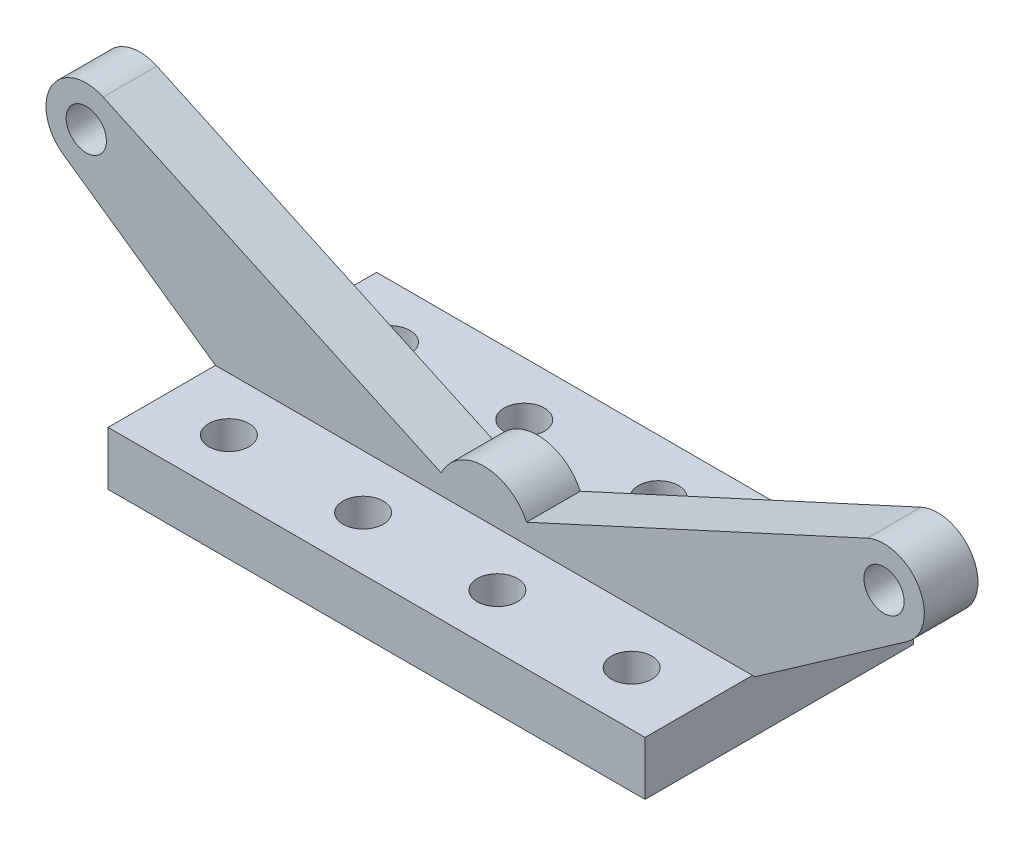
ISO-10303-21;
HEADER;
FILE_DESCRIPTION(('STEP AP214'),'2;1');
FILE_NAME('part.step','',(''),(''),'','','');
FILE_SCHEMA(('AUTOMOTIVE_DESIGN { 1 0 10303 214 1 1 1 1 }'));
ENDSEC;
DATA;
#1=APPLICATION_CONTEXT('core data for automotive mechanical design processes');
#2=APPLICATION_PROTOCOL_DEFINITION('international standard','automotive_design',2000,#1);
#3=PRODUCT_CONTEXT('',#1,'mechanical');
#4=PRODUCT('Part','Part','',(#3));
#5=PRODUCT_RELATED_PRODUCT_CATEGORY('part','',(#4));
#6=PRODUCT_DEFINITION_FORMATION('','',#4);
#7=PRODUCT_DEFINITION_CONTEXT('part definition',#1,'design');
#8=PRODUCT_DEFINITION('design','',#6,#7);
#9=PRODUCT_DEFINITION_SHAPE('','',#8);
#10=(LENGTH_UNIT() NAMED_UNIT(*) SI_UNIT(.MILLI.,.METRE.));
#11=(NAMED_UNIT(*) PLANE_ANGLE_UNIT() SI_UNIT($,.RADIAN.));
#12=(NAMED_UNIT(*) SI_UNIT($,.STERADIAN.) SOLID_ANGLE_UNIT());
#13=UNCERTAINTY_MEASURE_WITH_UNIT(LENGTH_MEASURE(1.E-05),#10,'distance_accuracy_value','');
#14=(GEOMETRIC_REPRESENTATION_CONTEXT(3) GLOBAL_UNCERTAINTY_ASSIGNED_CONTEXT((#13)) GLOBAL_UNIT_ASSIGNED_CONTEXT((#10,
#11,#12)) REPRESENTATION_CONTEXT('',''));
#15=CARTESIAN_POINT('',(0.,0.,0.));
#16=DIRECTION('',(0.,0.,1.));
#17=DIRECTION('',(1.,0.,0.));
#18=AXIS2_PLACEMENT_3D('',#15,#16,#17);
#19=CARTESIAN_POINT('',(-75.,20.,30.));
#20=DIRECTION('',(0.,1.,0.));
#21=DIRECTION('',(0.,0.,1.));
#22=AXIS2_PLACEMENT_3D('',#19,#20,#21);
#23=CYLINDRICAL_SURFACE('',#22,7.50000000000001);
#24=CARTESIAN_POINT('',(-75.,20.,30.));
#25=DIRECTION('',(0.,1.,0.));
#26=DIRECTION('',(0.,0.,1.));
#27=AXIS2_PLACEMENT_3D('',#24,#25,#26);
#28=CIRCLE('',#27,7.50000000000001);
#29=CARTESIAN_POINT('',(-75.,20.,37.5));
#30=VERTEX_POINT('',#29);
#31=EDGE_CURVE('E53',#30,#30,#28,.T.);
#32=ORIENTED_EDGE('',*,*,#31,.T.);
#33=EDGE_LOOP('',(#32));
#34=FACE_BOUND('',#33,.T.);
#35=CARTESIAN_POINT('',(-75.,0.,30.));
#36=DIRECTION('',(0.,-1.,0.));
#37=DIRECTION('',(0.,0.,-1.));
#38=AXIS2_PLACEMENT_3D('',#35,#36,#37);
#39=CIRCLE('',#38,7.50000000000001);
#40=CARTESIAN_POINT('',(-75.,0.,22.5));
#41=VERTEX_POINT('',#40);
#42=EDGE_CURVE('E11',#41,#41,#39,.T.);
#43=ORIENTED_EDGE('',*,*,#42,.T.);
#44=EDGE_LOOP('',(#43));
#45=FACE_BOUND('',#44,.T.);
#46=ADVANCED_FACE('F45',(#34,#45),#23,.F.);
#47=CARTESIAN_POINT('',(-25.,20.,30.));
#48=DIRECTION('',(0.,1.,0.));
#49=DIRECTION('',(0.,0.,1.));
#50=AXIS2_PLACEMENT_3D('',#47,#48,#49);
#51=CYLINDRICAL_SURFACE('',#50,7.50000000000001);
#52=CARTESIAN_POINT('',(-25.,20.,30.));
#53=DIRECTION('',(0.,1.,0.));
#54=DIRECTION('',(0.,0.,1.));
#55=AXIS2_PLACEMENT_3D('',#52,#53,#54);
#56=CIRCLE('',#55,7.50000000000001);
#57=CARTESIAN_POINT('',(-25.,20.,37.5));
#58=VERTEX_POINT('',#57);
#59=EDGE_CURVE('E280',#58,#58,#56,.T.);
#60=ORIENTED_EDGE('',*,*,#59,.T.);
#61=EDGE_LOOP('',(#60));
#62=FACE_BOUND('',#61,.T.);
#63=CARTESIAN_POINT('',(-25.,0.,30.));
#64=DIRECTION('',(0.,-1.,0.));
#65=DIRECTION('',(0.,0.,-1.));
#66=AXIS2_PLACEMENT_3D('',#63,#64,#65);
#67=CIRCLE('',#66,7.50000000000001);
#68=CARTESIAN_POINT('',(-25.,0.,22.5));
#69=VERTEX_POINT('',#68);
#70=EDGE_CURVE('E296',#69,#69,#67,.T.);
#71=ORIENTED_EDGE('',*,*,#70,.T.);
#72=EDGE_LOOP('',(#71));
#73=FACE_BOUND('',#72,.T.);
#74=ADVANCED_FACE('F326',(#62,#73),#51,.F.);
#75=CARTESIAN_POINT('',(-100.,20.,-50.));
#76=DIRECTION('',(0.,1.,0.));
#77=DIRECTION('',(0.,0.,1.));
#78=AXIS2_PLACEMENT_3D('',#75,#76,#77);
#79=PLANE('',#78);
#80=CARTESIAN_POINT('',(-75.,20.,-30.));
#81=DIRECTION('',(0.,1.,0.));
#82=DIRECTION('',(0.,0.,1.));
#83=AXIS2_PLACEMENT_3D('',#80,#81,#82);
#84=CIRCLE('',#83,7.50000000000001);
#85=CARTESIAN_POINT('',(-75.,20.,-22.5));
#86=VERTEX_POINT('',#85);
#87=EDGE_CURVE('E603',#86,#86,#84,.T.);
#88=ORIENTED_EDGE('',*,*,#87,.F.);
#89=EDGE_LOOP('',(#88));
#90=FACE_BOUND('',#89,.T.);
#91=CARTESIAN_POINT('',(-25.,20.,-30.));
#92=DIRECTION('',(0.,1.,0.));
#93=DIRECTION('',(0.,0.,1.));
#94=AXIS2_PLACEMENT_3D('',#91,#92,#93);
#95=CIRCLE('',#94,7.50000000000001);
#96=CARTESIAN_POINT('',(-25.,20.,-22.5));
#97=VERTEX_POINT('',#96);
#98=EDGE_CURVE('E605',#97,#97,#95,.T.);
#99=ORIENTED_EDGE('',*,*,#98,.F.);
#100=EDGE_LOOP('',(#99));
#101=FACE_BOUND('',#100,.T.);
#102=CARTESIAN_POINT('',(25.,20.,-30.));
#103=DIRECTION('',(0.,1.,0.));
#104=DIRECTION('',(0.,0.,1.));
#105=AXIS2_PLACEMENT_3D('',#102,#103,#104);
#106=CIRCLE('',#105,7.50000000000001);
#107=CARTESIAN_POINT('',(25.,20.,-22.5));
#108=VERTEX_POINT('',#107);
#109=EDGE_CURVE('E615',#108,#108,#106,.T.);
#110=ORIENTED_EDGE('',*,*,#109,.F.);
#111=EDGE_LOOP('',(#110));
#112=FACE_BOUND('',#111,.T.);
#113=CARTESIAN_POINT('',(75.,20.,-30.));
#114=DIRECTION('',(0.,1.,0.));
#115=DIRECTION('',(0.,0.,1.));
#116=AXIS2_PLACEMENT_3D('',#113,#114,#115);
#117=CIRCLE('',#116,7.50000000000001);
#118=CARTESIAN_POINT('',(75.,20.,-22.5));
#119=VERTEX_POINT('',#118);
#120=EDGE_CURVE('E621',#119,#119,#117,.T.);
#121=ORIENTED_EDGE('',*,*,#120,.F.);
#122=EDGE_LOOP('',(#121));
#123=FACE_BOUND('',#122,.T.);
#124=DIRECTION('',(0.,0.,1.));
#125=VECTOR('',#124,1.);
#126=CARTESIAN_POINT('',(-100.,20.,-50.));
#127=LINE('',#126,#125);
#128=CARTESIAN_POINT('',(-100.,20.,-50.));
#129=VERTEX_POINT('',#128);
#130=CARTESIAN_POINT('',(-100.,20.,-10.));
#131=VERTEX_POINT('',#130);
#132=EDGE_CURVE('E68',#129,#131,#127,.T.);
#133=ORIENTED_EDGE('',*,*,#132,.T.);
#134=DIRECTION('',(1.,0.,0.));
#135=VECTOR('',#134,1.);
#136=CARTESIAN_POINT('',(-100.,20.,-10.));
#137=LINE('',#136,#135);
#138=CARTESIAN_POINT('',(100.,20.,-10.));
#139=VERTEX_POINT('',#138);
#140=EDGE_CURVE('E205',#131,#139,#137,.T.);
#141=ORIENTED_EDGE('',*,*,#140,.T.);
#142=DIRECTION('',(0.,0.,1.));
#143=VECTOR('',#142,1.);
#144=CARTESIAN_POINT('',(100.,20.,-50.));
#145=LINE('',#144,#143);
#146=CARTESIAN_POINT('',(100.,20.,-50.));
#147=VERTEX_POINT('',#146);
#148=EDGE_CURVE('E282',#147,#139,#145,.T.);
#149=ORIENTED_EDGE('',*,*,#148,.F.);
#150=DIRECTION('',(-1.,0.,0.));
#151=VECTOR('',#150,1.);
#152=CARTESIAN_POINT('',(-100.,20.,-50.));
#153=LINE('',#152,#151);
#154=EDGE_CURVE('E273',#147,#129,#153,.T.);
#155=ORIENTED_EDGE('',*,*,#154,.T.);
#156=EDGE_LOOP('',(#133,#141,#149,#155));
#157=FACE_BOUND('',#156,.T.);
#158=ADVANCED_FACE('F311',(#90,#101,#112,#123,#157),#79,.T.);
#159=CARTESIAN_POINT('',(-100.,20.,-50.));
#160=DIRECTION('',(-1.,0.,0.));
#161=DIRECTION('',(0.,0.,1.));
#162=AXIS2_PLACEMENT_3D('',#159,#160,#161);
#163=PLANE('',#162);
#164=DIRECTION('',(0.,0.,1.));
#165=VECTOR('',#164,1.);
#166=CARTESIAN_POINT('',(-100.,0.,-50.));
#167=LINE('',#166,#165);
#168=CARTESIAN_POINT('',(-100.,0.,-50.));
#169=VERTEX_POINT('',#168);
#170=CARTESIAN_POINT('',(-100.,0.,50.));
#171=VERTEX_POINT('',#170);
#172=EDGE_CURVE('E277',#169,#171,#167,.T.);
#173=ORIENTED_EDGE('',*,*,#172,.T.);
#174=DIRECTION('',(0.,-1.,0.));
#175=VECTOR('',#174,1.);
#176=CARTESIAN_POINT('',(-100.,20.,50.));
#177=LINE('',#176,#175);
#178=CARTESIAN_POINT('',(-100.,20.,50.));
#179=VERTEX_POINT('',#178);
#180=EDGE_CURVE('E228',#179,#171,#177,.T.);
#181=ORIENTED_EDGE('',*,*,#180,.F.);
#182=CARTESIAN_POINT('',(-100.,20.,10.));
#183=VERTEX_POINT('',#182);
#184=EDGE_CURVE('E281',#183,#179,#127,.T.);
#185=ORIENTED_EDGE('',*,*,#184,.F.);
#186=DIRECTION('',(0.,0.,1.));
#187=VECTOR('',#186,1.);
#188=CARTESIAN_POINT('',(-100.,20.,-10.));
#189=LINE('',#188,#187);
#190=EDGE_CURVE('E154',#131,#183,#189,.T.);
#191=ORIENTED_EDGE('',*,*,#190,.F.);
#192=ORIENTED_EDGE('',*,*,#132,.F.);
#193=DIRECTION('',(0.,-1.,0.));
#194=VECTOR('',#193,1.);
#195=CARTESIAN_POINT('',(-100.,20.,-50.));
#196=LINE('',#195,#194);
#197=EDGE_CURVE('E262',#129,#169,#196,.T.);
#198=ORIENTED_EDGE('',*,*,#197,.T.);
#199=EDGE_LOOP('',(#173,#181,#185,#191,#192,#198));
#200=FACE_BOUND('',#199,.T.);
#201=ADVANCED_FACE('F308',(#200),#163,.T.);
#202=CARTESIAN_POINT('',(25.,20.,30.));
#203=DIRECTION('',(0.,1.,0.));
#204=DIRECTION('',(0.,0.,1.));
#205=AXIS2_PLACEMENT_3D('',#202,#203,#204);
#206=CIRCLE('',#205,7.50000000000001);
#207=CARTESIAN_POINT('',(25.,20.,37.5));
#208=VERTEX_POINT('',#207);
#209=EDGE_CURVE('E627',#208,#208,#206,.T.);
#210=ORIENTED_EDGE('',*,*,#209,.F.);
#211=EDGE_LOOP('',(#210));
#212=FACE_BOUND('',#211,.T.);
#213=CARTESIAN_POINT('',(75.,20.,30.));
#214=DIRECTION('',(0.,1.,0.));
#215=DIRECTION('',(0.,0.,1.));
#216=AXIS2_PLACEMENT_3D('',#213,#214,#215);
#217=CIRCLE('',#216,7.50000000000001);
#218=CARTESIAN_POINT('',(75.,20.,37.5));
#219=VERTEX_POINT('',#218);
#220=EDGE_CURVE('E633',#219,#219,#217,.T.);
#221=ORIENTED_EDGE('',*,*,#220,.F.);
#222=EDGE_LOOP('',(#221));
#223=FACE_BOUND('',#222,.T.);
#224=DIRECTION('',(1.,0.,0.));
#225=VECTOR('',#224,1.);
#226=CARTESIAN_POINT('',(-100.,20.,10.));
#227=LINE('',#226,#225);
#228=CARTESIAN_POINT('',(100.,20.,10.));
#229=VERTEX_POINT('',#228);
#230=EDGE_CURVE('E179',#183,#229,#227,.T.);
#231=ORIENTED_EDGE('',*,*,#230,.F.);
#232=ORIENTED_EDGE('',*,*,#184,.T.);
#233=DIRECTION('',(-1.,0.,0.));
#234=VECTOR('',#233,1.);
#235=CARTESIAN_POINT('',(-100.,20.,50.));
#236=LINE('',#235,#234);
#237=CARTESIAN_POINT('',(100.,20.,50.));
#238=VERTEX_POINT('',#237);
#239=EDGE_CURVE('E258',#238,#179,#236,.T.);
#240=ORIENTED_EDGE('',*,*,#239,.F.);
#241=EDGE_CURVE('E287',#229,#238,#145,.T.);
#242=ORIENTED_EDGE('',*,*,#241,.F.);
#243=EDGE_LOOP('',(#231,#232,#240,#242));
#244=FACE_BOUND('',#243,.T.);
#245=ORIENTED_EDGE('',*,*,#59,.F.);
#246=EDGE_LOOP('',(#245));
#247=FACE_BOUND('',#246,.T.);
#248=ORIENTED_EDGE('',*,*,#31,.F.);
#249=EDGE_LOOP('',(#248));
#250=FACE_BOUND('',#249,.T.);
#251=ADVANCED_FACE('F305',(#212,#223,#244,#247,#250),#79,.T.);
#252=CARTESIAN_POINT('',(100.,20.,-50.));
#253=DIRECTION('',(1.,0.,0.));
#254=DIRECTION('',(0.,0.,-1.));
#255=AXIS2_PLACEMENT_3D('',#252,#253,#254);
#256=PLANE('',#255);
#257=ORIENTED_EDGE('',*,*,#148,.T.);
#258=EDGE_CURVE('E286',#139,#229,#145,.T.);
#259=ORIENTED_EDGE('',*,*,#258,.T.);
#260=ORIENTED_EDGE('',*,*,#241,.T.);
#261=DIRECTION('',(0.,1.,0.));
#262=VECTOR('',#261,1.);
#263=CARTESIAN_POINT('',(100.,20.,50.));
#264=LINE('',#263,#262);
#265=CARTESIAN_POINT('',(100.,0.,50.));
#266=VERTEX_POINT('',#265);
#267=EDGE_CURVE('E254',#266,#238,#264,.T.);
#268=ORIENTED_EDGE('',*,*,#267,.F.);
#269=DIRECTION('',(0.,0.,1.));
#270=VECTOR('',#269,1.);
#271=CARTESIAN_POINT('',(100.,0.,-50.));
#272=LINE('',#271,#270);
#273=CARTESIAN_POINT('',(100.,0.,-50.));
#274=VERTEX_POINT('',#273);
#275=EDGE_CURVE('E288',#274,#266,#272,.T.);
#276=ORIENTED_EDGE('',*,*,#275,.F.);
#277=DIRECTION('',(0.,1.,0.));
#278=VECTOR('',#277,1.);
#279=CARTESIAN_POINT('',(100.,20.,-50.));
#280=LINE('',#279,#278);
#281=EDGE_CURVE('E269',#274,#147,#280,.T.);
#282=ORIENTED_EDGE('',*,*,#281,.T.);
#283=EDGE_LOOP('',(#257,#259,#260,#268,#276,#282));
#284=FACE_BOUND('',#283,.T.);
#285=ADVANCED_FACE('F307',(#284),#256,.T.);
#286=CARTESIAN_POINT('',(-100.,0.,-50.));
#287=DIRECTION('',(0.,-1.,0.));
#288=DIRECTION('',(0.,0.,-1.));
#289=AXIS2_PLACEMENT_3D('',#286,#287,#288);
#290=PLANE('',#289);
#291=CARTESIAN_POINT('',(-75.,0.,-30.));
#292=DIRECTION('',(0.,-1.,0.));
#293=DIRECTION('',(0.,0.,-1.));
#294=AXIS2_PLACEMENT_3D('',#291,#292,#293);
#295=CIRCLE('',#294,7.50000000000001);
#296=CARTESIAN_POINT('',(-75.,0.,-37.5));
#297=VERTEX_POINT('',#296);
#298=EDGE_CURVE('E349',#297,#297,#295,.T.);
#299=ORIENTED_EDGE('',*,*,#298,.F.);
#300=EDGE_LOOP('',(#299));
#301=FACE_BOUND('',#300,.T.);
#302=CARTESIAN_POINT('',(-25.,0.,-30.));
#303=DIRECTION('',(0.,-1.,0.));
#304=DIRECTION('',(0.,0.,-1.));
#305=AXIS2_PLACEMENT_3D('',#302,#303,#304);
#306=CIRCLE('',#305,7.50000000000001);
#307=CARTESIAN_POINT('',(-25.,0.,-37.5));
#308=VERTEX_POINT('',#307);
#309=EDGE_CURVE('E353',#308,#308,#306,.T.);
#310=ORIENTED_EDGE('',*,*,#309,.F.);
#311=EDGE_LOOP('',(#310));
#312=FACE_BOUND('',#311,.T.);
#313=CARTESIAN_POINT('',(25.,0.,-30.));
#314=DIRECTION('',(0.,-1.,0.));
#315=DIRECTION('',(0.,0.,-1.));
#316=AXIS2_PLACEMENT_3D('',#313,#314,#315);
#317=CIRCLE('',#316,7.50000000000001);
#318=CARTESIAN_POINT('',(25.,0.,-37.5));
#319=VERTEX_POINT('',#318);
#320=EDGE_CURVE('E357',#319,#319,#317,.T.);
#321=ORIENTED_EDGE('',*,*,#320,.F.);
#322=EDGE_LOOP('',(#321));
#323=FACE_BOUND('',#322,.T.);
#324=CARTESIAN_POINT('',(75.,0.,-30.));
#325=DIRECTION('',(0.,-1.,0.));
#326=DIRECTION('',(0.,0.,-1.));
#327=AXIS2_PLACEMENT_3D('',#324,#325,#326);
#328=CIRCLE('',#327,7.50000000000001);
#329=CARTESIAN_POINT('',(75.,0.,-37.5));
#330=VERTEX_POINT('',#329);
#331=EDGE_CURVE('E361',#330,#330,#328,.T.);
#332=ORIENTED_EDGE('',*,*,#331,.F.);
#333=EDGE_LOOP('',(#332));
#334=FACE_BOUND('',#333,.T.);
#335=CARTESIAN_POINT('',(25.,0.,30.));
#336=DIRECTION('',(0.,-1.,0.));
#337=DIRECTION('',(0.,0.,-1.));
#338=AXIS2_PLACEMENT_3D('',#335,#336,#337);
#339=CIRCLE('',#338,7.50000000000001);
#340=CARTESIAN_POINT('',(25.,0.,22.5));
#341=VERTEX_POINT('',#340);
#342=EDGE_CURVE('E365',#341,#341,#339,.T.);
#343=ORIENTED_EDGE('',*,*,#342,.F.);
#344=EDGE_LOOP('',(#343));
#345=FACE_BOUND('',#344,.T.);
#346=CARTESIAN_POINT('',(75.,0.,30.));
#347=DIRECTION('',(0.,-1.,0.));
#348=DIRECTION('',(0.,0.,-1.));
#349=AXIS2_PLACEMENT_3D('',#346,#347,#348);
#350=CIRCLE('',#349,7.50000000000001);
#351=CARTESIAN_POINT('',(75.,0.,22.5));
#352=VERTEX_POINT('',#351);
#353=EDGE_CURVE('E369',#352,#352,#350,.T.);
#354=ORIENTED_EDGE('',*,*,#353,.F.);
#355=EDGE_LOOP('',(#354));
#356=FACE_BOUND('',#355,.T.);
#357=ORIENTED_EDGE('',*,*,#275,.T.);
#358=DIRECTION('',(1.,0.,0.));
#359=VECTOR('',#358,1.);
#360=CARTESIAN_POINT('',(-100.,0.,50.));
#361=LINE('',#360,#359);
#362=EDGE_CURVE('E250',#171,#266,#361,.T.);
#363=ORIENTED_EDGE('',*,*,#362,.F.);
#364=ORIENTED_EDGE('',*,*,#172,.F.);
#365=DIRECTION('',(1.,0.,0.));
#366=VECTOR('',#365,1.);
#367=CARTESIAN_POINT('',(-100.,0.,-50.));
#368=LINE('',#367,#366);
#369=EDGE_CURVE('E265',#169,#274,#368,.T.);
#370=ORIENTED_EDGE('',*,*,#369,.T.);
#371=EDGE_LOOP('',(#357,#363,#364,#370));
#372=FACE_BOUND('',#371,.T.);
#373=ORIENTED_EDGE('',*,*,#70,.F.);
#374=EDGE_LOOP('',(#373));
#375=FACE_BOUND('',#374,.T.);
#376=ORIENTED_EDGE('',*,*,#42,.F.);
#377=EDGE_LOOP('',(#376));
#378=FACE_BOUND('',#377,.T.);
#379=ADVANCED_FACE('F317',(#301,#312,#323,#334,#345,#356,#372,#375,#378),#290,.T.);
#380=CARTESIAN_POINT('',(0.,0.,-50.));
#381=DIRECTION('',(0.,0.,1.));
#382=DIRECTION('',(1.,0.,0.));
#383=AXIS2_PLACEMENT_3D('',#380,#381,#382);
#384=PLANE('',#383);
#385=ORIENTED_EDGE('',*,*,#197,.F.);
#386=ORIENTED_EDGE('',*,*,#154,.F.);
#387=ORIENTED_EDGE('',*,*,#281,.F.);
#388=ORIENTED_EDGE('',*,*,#369,.F.);
#389=EDGE_LOOP('',(#385,#386,#387,#388));
#390=FACE_BOUND('',#389,.T.);
#391=ADVANCED_FACE('F338',(#390),#384,.F.);
#392=CARTESIAN_POINT('',(0.,0.,50.));
#393=DIRECTION('',(0.,0.,1.));
#394=DIRECTION('',(1.,0.,0.));
#395=AXIS2_PLACEMENT_3D('',#392,#393,#394);
#396=PLANE('',#395);
#397=ORIENTED_EDGE('',*,*,#180,.T.);
#398=ORIENTED_EDGE('',*,*,#362,.T.);
#399=ORIENTED_EDGE('',*,*,#267,.T.);
#400=ORIENTED_EDGE('',*,*,#239,.T.);
#401=EDGE_LOOP('',(#397,#398,#399,#400));
#402=FACE_BOUND('',#401,.T.);
#403=ADVANCED_FACE('F344',(#402),#396,.T.);
#404=CARTESIAN_POINT('',(-100.,20.,-10.));
#405=DIRECTION('',(0.,-1.,0.));
#406=DIRECTION('',(0.,0.,-1.));
#407=AXIS2_PLACEMENT_3D('',#404,#405,#406);
#408=PLANE('',#407);
#409=ORIENTED_EDGE('',*,*,#258,.F.);
#410=CARTESIAN_POINT('',(100.888005583727,20.,-10.));
#411=VERTEX_POINT('',#410);
#412=EDGE_CURVE('E60',#139,#411,#137,.T.);
#413=ORIENTED_EDGE('',*,*,#412,.T.);
#414=DIRECTION('',(0.,0.,1.));
#415=VECTOR('',#414,1.);
#416=CARTESIAN_POINT('',(100.888005583727,20.,-10.));
#417=LINE('',#416,#415);
#418=CARTESIAN_POINT('',(100.888005583727,20.,10.));
#419=VERTEX_POINT('',#418);
#420=EDGE_CURVE('E241',#411,#419,#417,.T.);
#421=ORIENTED_EDGE('',*,*,#420,.T.);
#422=EDGE_CURVE('E164',#229,#419,#227,.T.);
#423=ORIENTED_EDGE('',*,*,#422,.F.);
#424=EDGE_LOOP('',(#409,#413,#421,#423));
#425=FACE_BOUND('',#424,.T.);
#426=ADVANCED_FACE('F412',(#425),#408,.T.);
#427=CARTESIAN_POINT('',(-148.111994416273,72.,-10.));
#428=DIRECTION('',(0.,0.,1.));
#429=DIRECTION('',(1.,0.,0.));
#430=AXIS2_PLACEMENT_3D('',#427,#428,#429);
#431=CYLINDRICAL_SURFACE('',#430,15.);
#432=DIRECTION('',(0.,0.,1.));
#433=VECTOR('',#432,1.);
#434=CARTESIAN_POINT('',(-156.715640961539,59.7127193356651,-10.));
#435=LINE('',#434,#433);
#436=CARTESIAN_POINT('',(-156.715640961539,59.7127193356651,-10.));
#437=VERTEX_POINT('',#436);
#438=CARTESIAN_POINT('',(-156.715640961539,59.7127193356651,10.));
#439=VERTEX_POINT('',#438);
#440=EDGE_CURVE('E142',#437,#439,#435,.T.);
#441=ORIENTED_EDGE('',*,*,#440,.T.);
#442=CARTESIAN_POINT('',(-148.111994416273,72.,10.));
#443=DIRECTION('',(0.,0.,1.));
#444=DIRECTION('',(1.,0.,0.));
#445=AXIS2_PLACEMENT_3D('',#442,#443,#444);
#446=CIRCLE('',#445,15.);
#447=CARTESIAN_POINT('',(-141.813369554398,85.613497891775,10.));
#448=VERTEX_POINT('',#447);
#449=EDGE_CURVE('E146',#448,#439,#446,.T.);
#450=ORIENTED_EDGE('',*,*,#449,.F.);
#451=DIRECTION('',(0.,0.,1.));
#452=VECTOR('',#451,1.);
#453=CARTESIAN_POINT('',(-141.813369554398,85.613497891775,-10.));
#454=LINE('',#453,#452);
#455=CARTESIAN_POINT('',(-141.813369554398,85.613497891775,-10.));
#456=VERTEX_POINT('',#455);
#457=EDGE_CURVE('E225',#456,#448,#454,.T.);
#458=ORIENTED_EDGE('',*,*,#457,.F.);
#459=CARTESIAN_POINT('',(-148.111994416273,72.,-10.));
#460=DIRECTION('',(0.,0.,1.));
#461=DIRECTION('',(1.,0.,0.));
#462=AXIS2_PLACEMENT_3D('',#459,#460,#461);
#463=CIRCLE('',#462,15.);
#464=EDGE_CURVE('E149',#456,#437,#463,.T.);
#465=ORIENTED_EDGE('',*,*,#464,.T.);
#466=EDGE_LOOP('',(#441,#450,#458,#465));
#467=FACE_BOUND('',#466,.T.);
#468=ADVANCED_FACE('F144',(#467),#431,.T.);
#469=CARTESIAN_POINT('',(-141.813369554398,85.613497891775,-10.));
#470=DIRECTION('',(-0.419908324125033,-0.907566526118337,0.));
#471=DIRECTION('',(0.907566526118337,-0.419908324125033,0.));
#472=AXIS2_PLACEMENT_3D('',#469,#470,#471);
#473=PLANE('',#472);
#474=ORIENTED_EDGE('',*,*,#457,.T.);
#475=DIRECTION('',(0.907566526118337,-0.419908324125033,0.));
#476=VECTOR('',#475,1.);
#477=CARTESIAN_POINT('',(-141.813369554398,85.613497891775,10.));
#478=LINE('',#477,#476);
#479=CARTESIAN_POINT('',(-15.8824142070709,27.348395672188,10.));
#480=VERTEX_POINT('',#479);
#481=EDGE_CURVE('E169',#448,#480,#478,.T.);
#482=ORIENTED_EDGE('',*,*,#481,.T.);
#483=DIRECTION('',(0.,0.,1.));
#484=VECTOR('',#483,1.);
#485=CARTESIAN_POINT('',(-15.8824142070709,27.348395672188,-10.));
#486=LINE('',#485,#484);
#487=CARTESIAN_POINT('',(-15.8824142070709,27.348395672188,-10.));
#488=VERTEX_POINT('',#487);
#489=EDGE_CURVE('E229',#488,#480,#486,.T.);
#490=ORIENTED_EDGE('',*,*,#489,.F.);
#491=DIRECTION('',(0.907566526118337,-0.419908324125033,0.));
#492=VECTOR('',#491,1.);
#493=CARTESIAN_POINT('',(-141.813369554398,85.613497891775,-10.));
#494=LINE('',#493,#492);
#495=EDGE_CURVE('E155',#456,#488,#494,.T.);
#496=ORIENTED_EDGE('',*,*,#495,.F.);
#497=EDGE_LOOP('',(#474,#482,#490,#496));
#498=FACE_BOUND('',#497,.T.);
#499=ADVANCED_FACE('F397',(#498),#473,.F.);
#500=CARTESIAN_POINT('',(0.,20.,-10.));
#501=DIRECTION('',(0.,0.,1.));
#502=DIRECTION('',(1.,0.,0.));
#503=AXIS2_PLACEMENT_3D('',#500,#501,#502);
#504=CYLINDRICAL_SURFACE('',#503,17.5);
#505=ORIENTED_EDGE('',*,*,#489,.T.);
#506=CARTESIAN_POINT('',(0.,20.,10.));
#507=DIRECTION('',(0.,0.,-1.));
#508=DIRECTION('',(-1.,0.,0.));
#509=AXIS2_PLACEMENT_3D('',#506,#507,#508);
#510=CIRCLE('',#509,17.5);
#511=CARTESIAN_POINT('',(15.8824142070709,27.3483956721881,10.));
#512=VERTEX_POINT('',#511);
#513=EDGE_CURVE('E194',#480,#512,#510,.T.);
#514=ORIENTED_EDGE('',*,*,#513,.T.);
#515=DIRECTION('',(0.,0.,1.));
#516=VECTOR('',#515,1.);
#517=CARTESIAN_POINT('',(15.8824142070709,27.3483956721881,-10.));
#518=LINE('',#517,#516);
#519=CARTESIAN_POINT('',(15.8824142070709,27.3483956721881,-10.));
#520=VERTEX_POINT('',#519);
#521=EDGE_CURVE('E232',#520,#512,#518,.T.);
#522=ORIENTED_EDGE('',*,*,#521,.F.);
#523=CARTESIAN_POINT('',(0.,20.,-10.));
#524=DIRECTION('',(0.,0.,-1.));
#525=DIRECTION('',(-1.,0.,0.));
#526=AXIS2_PLACEMENT_3D('',#523,#524,#525);
#527=CIRCLE('',#526,17.5);
#528=EDGE_CURVE('E220',#488,#520,#527,.T.);
#529=ORIENTED_EDGE('',*,*,#528,.F.);
#530=EDGE_LOOP('',(#505,#514,#522,#529));
#531=FACE_BOUND('',#530,.T.);
#532=ADVANCED_FACE('F399',(#531),#504,.T.);
#533=CARTESIAN_POINT('',(15.8824142070709,27.3483956721881,-10.));
#534=DIRECTION('',(0.417482362795023,-0.908685026153224,0.));
#535=DIRECTION('',(0.908685026153224,0.417482362795023,0.));
#536=AXIS2_PLACEMENT_3D('',#533,#534,#535);
#537=PLANE('',#536);
#538=ORIENTED_EDGE('',*,*,#521,.T.);
#539=DIRECTION('',(0.908685026153224,0.417482362795023,0.));
#540=VECTOR('',#539,1.);
#541=CARTESIAN_POINT('',(15.8824142070709,27.3483956721881,10.));
#542=LINE('',#541,#540);
#543=CARTESIAN_POINT('',(142.737764558075,85.6302753922983,10.));
#544=VERTEX_POINT('',#543);
#545=EDGE_CURVE('E190',#512,#544,#542,.T.);
#546=ORIENTED_EDGE('',*,*,#545,.T.);
#547=DIRECTION('',(0.,0.,1.));
#548=VECTOR('',#547,1.);
#549=CARTESIAN_POINT('',(142.737764558075,85.6302753922983,-10.));
#550=LINE('',#549,#548);
#551=CARTESIAN_POINT('',(142.737764558075,85.6302753922983,-10.));
#552=VERTEX_POINT('',#551);
#553=EDGE_CURVE('E235',#552,#544,#550,.T.);
#554=ORIENTED_EDGE('',*,*,#553,.F.);
#555=DIRECTION('',(0.908685026153224,0.417482362795023,0.));
#556=VECTOR('',#555,1.);
#557=CARTESIAN_POINT('',(15.8824142070709,27.3483956721881,-10.));
#558=LINE('',#557,#556);
#559=EDGE_CURVE('E217',#520,#552,#558,.T.);
#560=ORIENTED_EDGE('',*,*,#559,.F.);
#561=EDGE_LOOP('',(#538,#546,#554,#560));
#562=FACE_BOUND('',#561,.T.);
#563=ADVANCED_FACE('F404',(#562),#537,.F.);
#564=CARTESIAN_POINT('',(149.,72.,-10.));
#565=DIRECTION('',(0.,0.,1.));
#566=DIRECTION('',(1.,0.,0.));
#567=AXIS2_PLACEMENT_3D('',#564,#565,#566);
#568=CYLINDRICAL_SURFACE('',#567,15.);
#569=ORIENTED_EDGE('',*,*,#553,.T.);
#570=CARTESIAN_POINT('',(149.,72.,10.));
#571=DIRECTION('',(0.,0.,1.));
#572=DIRECTION('',(1.,0.,0.));
#573=AXIS2_PLACEMENT_3D('',#570,#571,#572);
#574=CIRCLE('',#573,15.);
#575=CARTESIAN_POINT('',(157.603646545266,59.7127193356651,10.));
#576=VERTEX_POINT('',#575);
#577=EDGE_CURVE('E186',#576,#544,#574,.T.);
#578=ORIENTED_EDGE('',*,*,#577,.F.);
#579=DIRECTION('',(0.,0.,1.));
#580=VECTOR('',#579,1.);
#581=CARTESIAN_POINT('',(157.603646545266,59.7127193356651,-10.));
#582=LINE('',#581,#580);
#583=CARTESIAN_POINT('',(157.603646545266,59.7127193356651,-10.));
#584=VERTEX_POINT('',#583);
#585=EDGE_CURVE('E238',#584,#576,#582,.T.);
#586=ORIENTED_EDGE('',*,*,#585,.F.);
#587=CARTESIAN_POINT('',(149.,72.,-10.));
#588=DIRECTION('',(0.,0.,1.));
#589=DIRECTION('',(1.,0.,0.));
#590=AXIS2_PLACEMENT_3D('',#587,#588,#589);
#591=CIRCLE('',#590,15.);
#592=EDGE_CURVE('E213',#584,#552,#591,.T.);
#593=ORIENTED_EDGE('',*,*,#592,.T.);
#594=EDGE_LOOP('',(#569,#578,#586,#593));
#595=FACE_BOUND('',#594,.T.);
#596=ADVANCED_FACE('F416',(#595),#568,.T.);
#597=CARTESIAN_POINT('',(100.888005583727,20.,-10.));
#598=DIRECTION('',(0.573576436351047,-0.819152044288991,0.));
#599=DIRECTION('',(0.819152044288991,0.573576436351047,0.));
#600=AXIS2_PLACEMENT_3D('',#597,#598,#599);
#601=PLANE('',#600);
#602=ORIENTED_EDGE('',*,*,#585,.T.);
#603=DIRECTION('',(0.819152044288991,0.573576436351047,0.));
#604=VECTOR('',#603,1.);
#605=CARTESIAN_POINT('',(100.888005583727,20.,10.));
#606=LINE('',#605,#604);
#607=EDGE_CURVE('E182',#419,#576,#606,.T.);
#608=ORIENTED_EDGE('',*,*,#607,.F.);
#609=ORIENTED_EDGE('',*,*,#420,.F.);
#610=DIRECTION('',(0.819152044288991,0.573576436351047,0.));
#611=VECTOR('',#610,1.);
#612=CARTESIAN_POINT('',(100.888005583727,20.,-10.));
#613=LINE('',#612,#611);
#614=EDGE_CURVE('E209',#411,#584,#613,.T.);
#615=ORIENTED_EDGE('',*,*,#614,.T.);
#616=EDGE_LOOP('',(#602,#608,#609,#615));
#617=FACE_BOUND('',#616,.T.);
#618=ADVANCED_FACE('F409',(#617),#601,.T.);
#619=CARTESIAN_POINT('',(-156.715640961539,59.7127193356651,-10.));
#620=DIRECTION('',(-0.573576436351047,-0.819152044288991,0.));
#621=DIRECTION('',(0.819152044288991,-0.573576436351047,0.));
#622=AXIS2_PLACEMENT_3D('',#619,#620,#621);
#623=PLANE('',#622);
#624=ORIENTED_EDGE('',*,*,#190,.T.);
#625=DIRECTION('',(0.819152044288991,-0.573576436351047,0.));
#626=VECTOR('',#625,1.);
#627=CARTESIAN_POINT('',(-156.715640961539,59.7127193356651,10.));
#628=LINE('',#627,#626);
#629=EDGE_CURVE('E158',#439,#183,#628,.T.);
#630=ORIENTED_EDGE('',*,*,#629,.F.);
#631=ORIENTED_EDGE('',*,*,#440,.F.);
#632=DIRECTION('',(0.819152044288991,-0.573576436351047,0.));
#633=VECTOR('',#632,1.);
#634=CARTESIAN_POINT('',(-156.715640961539,59.7127193356651,-10.));
#635=LINE('',#634,#633);
#636=EDGE_CURVE('E202',#437,#131,#635,.T.);
#637=ORIENTED_EDGE('',*,*,#636,.T.);
#638=EDGE_LOOP('',(#624,#630,#631,#637));
#639=FACE_BOUND('',#638,.T.);
#640=ADVANCED_FACE('F159',(#639),#623,.T.);
#641=CARTESIAN_POINT('',(-148.111994416273,72.,-10.));
#642=DIRECTION('',(0.,0.,1.));
#643=DIRECTION('',(1.,0.,0.));
#644=AXIS2_PLACEMENT_3D('',#641,#642,#643);
#645=PLANE('',#644);
#646=CARTESIAN_POINT('',(-148.111994416273,72.,-10.));
#647=DIRECTION('',(0.,0.,1.));
#648=DIRECTION('',(1.,0.,0.));
#649=AXIS2_PLACEMENT_3D('',#646,#647,#648);
#650=CIRCLE('',#649,7.50000000000001);
#651=CARTESIAN_POINT('',(-140.611994416273,72.,-10.));
#652=VERTEX_POINT('',#651);
#653=EDGE_CURVE('E643',#652,#652,#650,.T.);
#654=ORIENTED_EDGE('',*,*,#653,.T.);
#655=EDGE_LOOP('',(#654));
#656=FACE_BOUND('',#655,.T.);
#657=CARTESIAN_POINT('',(149.,72.,-10.));
#658=DIRECTION('',(0.,0.,1.));
#659=DIRECTION('',(1.,0.,0.));
#660=AXIS2_PLACEMENT_3D('',#657,#658,#659);
#661=CIRCLE('',#660,7.50000000000001);
#662=CARTESIAN_POINT('',(156.5,72.,-10.));
#663=VERTEX_POINT('',#662);
#664=EDGE_CURVE('E171',#663,#663,#661,.T.);
#665=ORIENTED_EDGE('',*,*,#664,.T.);
#666=EDGE_LOOP('',(#665));
#667=FACE_BOUND('',#666,.T.);
#668=ORIENTED_EDGE('',*,*,#464,.F.);
#669=ORIENTED_EDGE('',*,*,#495,.T.);
#670=ORIENTED_EDGE('',*,*,#528,.T.);
#671=ORIENTED_EDGE('',*,*,#559,.T.);
#672=ORIENTED_EDGE('',*,*,#592,.F.);
#673=ORIENTED_EDGE('',*,*,#614,.F.);
#674=ORIENTED_EDGE('',*,*,#412,.F.);
#675=ORIENTED_EDGE('',*,*,#140,.F.);
#676=ORIENTED_EDGE('',*,*,#636,.F.);
#677=EDGE_LOOP('',(#668,#669,#670,#671,#672,#673,#674,#675,#676));
#678=FACE_BOUND('',#677,.T.);
#679=ADVANCED_FACE('F391',(#656,#667,#678),#645,.F.);
#680=CARTESIAN_POINT('',(-148.111994416273,72.,10.));
#681=DIRECTION('',(0.,0.,1.));
#682=DIRECTION('',(1.,0.,0.));
#683=AXIS2_PLACEMENT_3D('',#680,#681,#682);
#684=PLANE('',#683);
#685=CARTESIAN_POINT('',(-148.111994416273,72.,10.));
#686=DIRECTION('',(0.,0.,1.));
#687=DIRECTION('',(1.,0.,0.));
#688=AXIS2_PLACEMENT_3D('',#685,#686,#687);
#689=CIRCLE('',#688,7.50000000000001);
#690=CARTESIAN_POINT('',(-140.611994416273,72.,10.));
#691=VERTEX_POINT('',#690);
#692=EDGE_CURVE('E639',#691,#691,#689,.T.);
#693=ORIENTED_EDGE('',*,*,#692,.F.);
#694=EDGE_LOOP('',(#693));
#695=FACE_BOUND('',#694,.T.);
#696=CARTESIAN_POINT('',(149.,72.,10.));
#697=DIRECTION('',(0.,0.,1.));
#698=DIRECTION('',(1.,0.,0.));
#699=AXIS2_PLACEMENT_3D('',#696,#697,#698);
#700=CIRCLE('',#699,7.50000000000001);
#701=CARTESIAN_POINT('',(156.5,72.,10.));
#702=VERTEX_POINT('',#701);
#703=EDGE_CURVE('E175',#702,#702,#700,.T.);
#704=ORIENTED_EDGE('',*,*,#703,.F.);
#705=EDGE_LOOP('',(#704));
#706=FACE_BOUND('',#705,.T.);
#707=ORIENTED_EDGE('',*,*,#449,.T.);
#708=ORIENTED_EDGE('',*,*,#629,.T.);
#709=ORIENTED_EDGE('',*,*,#230,.T.);
#710=ORIENTED_EDGE('',*,*,#422,.T.);
#711=ORIENTED_EDGE('',*,*,#607,.T.);
#712=ORIENTED_EDGE('',*,*,#577,.T.);
#713=ORIENTED_EDGE('',*,*,#545,.F.);
#714=ORIENTED_EDGE('',*,*,#513,.F.);
#715=ORIENTED_EDGE('',*,*,#481,.F.);
#716=EDGE_LOOP('',(#707,#708,#709,#710,#711,#712,#713,#714,#715));
#717=FACE_BOUND('',#716,.T.);
#718=ADVANCED_FACE('F166',(#695,#706,#717),#684,.T.);
#719=CARTESIAN_POINT('',(149.,72.,10.));
#720=DIRECTION('',(0.,0.,1.));
#721=DIRECTION('',(1.,0.,0.));
#722=AXIS2_PLACEMENT_3D('',#719,#720,#721);
#723=CYLINDRICAL_SURFACE('',#722,7.50000000000001);
#724=ORIENTED_EDGE('',*,*,#664,.F.);
#725=EDGE_LOOP('',(#724));
#726=FACE_BOUND('',#725,.T.);
#727=ORIENTED_EDGE('',*,*,#703,.T.);
#728=EDGE_LOOP('',(#727));
#729=FACE_BOUND('',#728,.T.);
#730=ADVANCED_FACE('F512',(#726,#729),#723,.F.);
#731=CARTESIAN_POINT('',(-148.111994416273,72.,10.));
#732=DIRECTION('',(0.,0.,1.));
#733=DIRECTION('',(1.,0.,0.));
#734=AXIS2_PLACEMENT_3D('',#731,#732,#733);
#735=CYLINDRICAL_SURFACE('',#734,7.50000000000001);
#736=ORIENTED_EDGE('',*,*,#653,.F.);
#737=EDGE_LOOP('',(#736));
#738=FACE_BOUND('',#737,.T.);
#739=ORIENTED_EDGE('',*,*,#692,.T.);
#740=EDGE_LOOP('',(#739));
#741=FACE_BOUND('',#740,.T.);
#742=ADVANCED_FACE('F522',(#738,#741),#735,.F.);
#743=CARTESIAN_POINT('',(75.,20.,30.));
#744=DIRECTION('',(0.,1.,0.));
#745=DIRECTION('',(0.,0.,1.));
#746=AXIS2_PLACEMENT_3D('',#743,#744,#745);
#747=CYLINDRICAL_SURFACE('',#746,7.50000000000001);
#748=ORIENTED_EDGE('',*,*,#220,.T.);
#749=EDGE_LOOP('',(#748));
#750=FACE_BOUND('',#749,.T.);
#751=ORIENTED_EDGE('',*,*,#353,.T.);
#752=EDGE_LOOP('',(#751));
#753=FACE_BOUND('',#752,.T.);
#754=ADVANCED_FACE('F532',(#750,#753),#747,.F.);
#755=CARTESIAN_POINT('',(25.,20.,30.));
#756=DIRECTION('',(0.,1.,0.));
#757=DIRECTION('',(0.,0.,1.));
#758=AXIS2_PLACEMENT_3D('',#755,#756,#757);
#759=CYLINDRICAL_SURFACE('',#758,7.50000000000001);
#760=ORIENTED_EDGE('',*,*,#209,.T.);
#761=EDGE_LOOP('',(#760));
#762=FACE_BOUND('',#761,.T.);
#763=ORIENTED_EDGE('',*,*,#342,.T.);
#764=EDGE_LOOP('',(#763));
#765=FACE_BOUND('',#764,.T.);
#766=ADVANCED_FACE('F540',(#762,#765),#759,.F.);
#767=CARTESIAN_POINT('',(75.,20.,-30.));
#768=DIRECTION('',(0.,1.,0.));
#769=DIRECTION('',(0.,0.,1.));
#770=AXIS2_PLACEMENT_3D('',#767,#768,#769);
#771=CYLINDRICAL_SURFACE('',#770,7.50000000000001);
#772=ORIENTED_EDGE('',*,*,#120,.T.);
#773=EDGE_LOOP('',(#772));
#774=FACE_BOUND('',#773,.T.);
#775=ORIENTED_EDGE('',*,*,#331,.T.);
#776=EDGE_LOOP('',(#775));
#777=FACE_BOUND('',#776,.T.);
#778=ADVANCED_FACE('F559',(#774,#777),#771,.F.);
#779=CARTESIAN_POINT('',(25.,20.,-30.));
#780=DIRECTION('',(0.,1.,0.));
#781=DIRECTION('',(0.,0.,1.));
#782=AXIS2_PLACEMENT_3D('',#779,#780,#781);
#783=CYLINDRICAL_SURFACE('',#782,7.50000000000001);
#784=ORIENTED_EDGE('',*,*,#109,.T.);
#785=EDGE_LOOP('',(#784));
#786=FACE_BOUND('',#785,.T.);
#787=ORIENTED_EDGE('',*,*,#320,.T.);
#788=EDGE_LOOP('',(#787));
#789=FACE_BOUND('',#788,.T.);
#790=ADVANCED_FACE('F567',(#786,#789),#783,.F.);
#791=CARTESIAN_POINT('',(-25.,20.,-30.));
#792=DIRECTION('',(0.,1.,0.));
#793=DIRECTION('',(0.,0.,1.));
#794=AXIS2_PLACEMENT_3D('',#791,#792,#793);
#795=CYLINDRICAL_SURFACE('',#794,7.50000000000001);
#796=ORIENTED_EDGE('',*,*,#98,.T.);
#797=EDGE_LOOP('',(#796));
#798=FACE_BOUND('',#797,.T.);
#799=ORIENTED_EDGE('',*,*,#309,.T.);
#800=EDGE_LOOP('',(#799));
#801=FACE_BOUND('',#800,.T.);
#802=ADVANCED_FACE('F577',(#798,#801),#795,.F.);
#803=CARTESIAN_POINT('',(-75.,20.,-30.));
#804=DIRECTION('',(0.,1.,0.));
#805=DIRECTION('',(0.,0.,1.));
#806=AXIS2_PLACEMENT_3D('',#803,#804,#805);
#807=CYLINDRICAL_SURFACE('',#806,7.50000000000001);
#808=ORIENTED_EDGE('',*,*,#87,.T.);
#809=EDGE_LOOP('',(#808));
#810=FACE_BOUND('',#809,.T.);
#811=ORIENTED_EDGE('',*,*,#298,.T.);
#812=EDGE_LOOP('',(#811));
#813=FACE_BOUND('',#812,.T.);
#814=ADVANCED_FACE('F587',(#810,#813),#807,.F.);
#815=CLOSED_SHELL('',(#46,#74,#158,#201,#251,#285,#379,#391,#403,#426,#468,#499,#532,#563,#596,
#618,#640,#679,#718,#730,#742,#754,#766,#778,#790,#802,#814));
#816=MANIFOLD_SOLID_BREP('B2',#815);
#817=ADVANCED_BREP_SHAPE_REPRESENTATION('',(#18,#816),#14);
#818=SHAPE_DEFINITION_REPRESENTATION(#9,#817);
ENDSEC;
END-ISO-10303-21;
